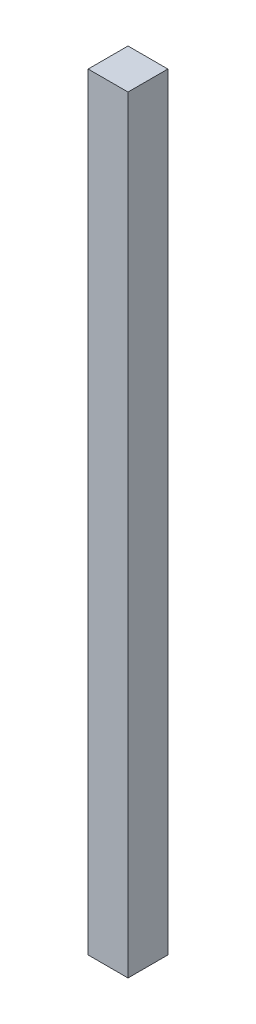
ISO-10303-21;
HEADER;
FILE_DESCRIPTION(('STEP AP214'),'2;1');
FILE_NAME('part.step','',(''),(''),'','','');
FILE_SCHEMA(('AUTOMOTIVE_DESIGN { 1 0 10303 214 1 1 1 1 }'));
ENDSEC;
DATA;
#1=APPLICATION_CONTEXT('core data for automotive mechanical design processes');
#2=APPLICATION_PROTOCOL_DEFINITION('international standard','automotive_design',2000,#1);
#3=PRODUCT_CONTEXT('',#1,'mechanical');
#4=PRODUCT('Part','Part','',(#3));
#5=PRODUCT_RELATED_PRODUCT_CATEGORY('part','',(#4));
#6=PRODUCT_DEFINITION_FORMATION('','',#4);
#7=PRODUCT_DEFINITION_CONTEXT('part definition',#1,'design');
#8=PRODUCT_DEFINITION('design','',#6,#7);
#9=PRODUCT_DEFINITION_SHAPE('','',#8);
#10=(LENGTH_UNIT() NAMED_UNIT(*) SI_UNIT(.MILLI.,.METRE.));
#11=(NAMED_UNIT(*) PLANE_ANGLE_UNIT() SI_UNIT($,.RADIAN.));
#12=(NAMED_UNIT(*) SI_UNIT($,.STERADIAN.) SOLID_ANGLE_UNIT());
#13=UNCERTAINTY_MEASURE_WITH_UNIT(LENGTH_MEASURE(1.E-05),#10,'distance_accuracy_value','');
#14=(GEOMETRIC_REPRESENTATION_CONTEXT(3) GLOBAL_UNCERTAINTY_ASSIGNED_CONTEXT((#13)) GLOBAL_UNIT_ASSIGNED_CONTEXT((#10,
#11,#12)) REPRESENTATION_CONTEXT('',''));
#15=CARTESIAN_POINT('',(0.,0.,0.));
#16=DIRECTION('',(0.,0.,1.));
#17=DIRECTION('',(1.,0.,0.));
#18=AXIS2_PLACEMENT_3D('',#15,#16,#17);
#19=CARTESIAN_POINT('',(0.3,11.55,0.3));
#20=DIRECTION('',(-1.,0.,0.));
#21=DIRECTION('',(0.,0.,1.));
#22=AXIS2_PLACEMENT_3D('',#19,#20,#21);
#23=PLANE('',#22);
#24=DIRECTION('',(0.,0.,-1.));
#25=VECTOR('',#24,1.);
#26=CARTESIAN_POINT('',(0.3,0.,0.3));
#27=LINE('',#26,#25);
#28=CARTESIAN_POINT('',(0.3,0.,0.3));
#29=VERTEX_POINT('',#28);
#30=CARTESIAN_POINT('',(0.3,0.,-0.3));
#31=VERTEX_POINT('',#30);
#32=EDGE_CURVE('E113',#29,#31,#27,.T.);
#33=ORIENTED_EDGE('',*,*,#32,.T.);
#34=DIRECTION('',(0.,-1.,0.));
#35=VECTOR('',#34,1.);
#36=CARTESIAN_POINT('',(0.3,11.55,-0.3));
#37=LINE('',#36,#35);
#38=CARTESIAN_POINT('',(0.3,11.55,-0.3));
#39=VERTEX_POINT('',#38);
#40=EDGE_CURVE('E11',#39,#31,#37,.T.);
#41=ORIENTED_EDGE('',*,*,#40,.F.);
#42=DIRECTION('',(0.,0.,-1.));
#43=VECTOR('',#42,1.);
#44=CARTESIAN_POINT('',(0.3,11.55,0.3));
#45=LINE('',#44,#43);
#46=CARTESIAN_POINT('',(0.3,11.55,0.3));
#47=VERTEX_POINT('',#46);
#48=EDGE_CURVE('E97',#47,#39,#45,.T.);
#49=ORIENTED_EDGE('',*,*,#48,.F.);
#50=DIRECTION('',(0.,-1.,0.));
#51=VECTOR('',#50,1.);
#52=CARTESIAN_POINT('',(0.3,11.55,0.3));
#53=LINE('',#52,#51);
#54=EDGE_CURVE('E109',#47,#29,#53,.T.);
#55=ORIENTED_EDGE('',*,*,#54,.T.);
#56=EDGE_LOOP('',(#33,#41,#49,#55));
#57=FACE_BOUND('',#56,.T.);
#58=ADVANCED_FACE('F45',(#57),#23,.F.);
#59=CARTESIAN_POINT('',(-0.3,11.55,-0.3));
#60=DIRECTION('',(0.,0.,1.));
#61=DIRECTION('',(1.,0.,0.));
#62=AXIS2_PLACEMENT_3D('',#59,#60,#61);
#63=PLANE('',#62);
#64=DIRECTION('',(-1.,0.,0.));
#65=VECTOR('',#64,1.);
#66=CARTESIAN_POINT('',(-0.3,0.,-0.3));
#67=LINE('',#66,#65);
#68=CARTESIAN_POINT('',(-0.3,0.,-0.3));
#69=VERTEX_POINT('',#68);
#70=EDGE_CURVE('E102',#31,#69,#67,.T.);
#71=ORIENTED_EDGE('',*,*,#70,.T.);
#72=DIRECTION('',(0.,-1.,0.));
#73=VECTOR('',#72,1.);
#74=CARTESIAN_POINT('',(-0.3,11.55,-0.3));
#75=LINE('',#74,#73);
#76=CARTESIAN_POINT('',(-0.3,11.55,-0.3));
#77=VERTEX_POINT('',#76);
#78=EDGE_CURVE('E54',#77,#69,#75,.T.);
#79=ORIENTED_EDGE('',*,*,#78,.F.);
#80=DIRECTION('',(-1.,0.,0.));
#81=VECTOR('',#80,1.);
#82=CARTESIAN_POINT('',(-0.3,11.55,-0.3));
#83=LINE('',#82,#81);
#84=EDGE_CURVE('E92',#39,#77,#83,.T.);
#85=ORIENTED_EDGE('',*,*,#84,.F.);
#86=ORIENTED_EDGE('',*,*,#40,.T.);
#87=EDGE_LOOP('',(#71,#79,#85,#86));
#88=FACE_BOUND('',#87,.T.);
#89=ADVANCED_FACE('F101',(#88),#63,.F.);
#90=CARTESIAN_POINT('',(-0.3,11.55,0.3));
#91=DIRECTION('',(1.,0.,0.));
#92=DIRECTION('',(0.,0.,-1.));
#93=AXIS2_PLACEMENT_3D('',#90,#91,#92);
#94=PLANE('',#93);
#95=DIRECTION('',(0.,0.,1.));
#96=VECTOR('',#95,1.);
#97=CARTESIAN_POINT('',(-0.3,0.,0.3));
#98=LINE('',#97,#96);
#99=CARTESIAN_POINT('',(-0.3,0.,0.3));
#100=VERTEX_POINT('',#99);
#101=EDGE_CURVE('E79',#69,#100,#98,.T.);
#102=ORIENTED_EDGE('',*,*,#101,.T.);
#103=DIRECTION('',(0.,-1.,0.));
#104=VECTOR('',#103,1.);
#105=CARTESIAN_POINT('',(-0.3,11.55,0.3));
#106=LINE('',#105,#104);
#107=CARTESIAN_POINT('',(-0.3,11.55,0.3));
#108=VERTEX_POINT('',#107);
#109=EDGE_CURVE('E104',#108,#100,#106,.T.);
#110=ORIENTED_EDGE('',*,*,#109,.F.);
#111=DIRECTION('',(0.,0.,1.));
#112=VECTOR('',#111,1.);
#113=CARTESIAN_POINT('',(-0.3,11.55,0.3));
#114=LINE('',#113,#112);
#115=EDGE_CURVE('E95',#77,#108,#114,.T.);
#116=ORIENTED_EDGE('',*,*,#115,.F.);
#117=ORIENTED_EDGE('',*,*,#78,.T.);
#118=EDGE_LOOP('',(#102,#110,#116,#117));
#119=FACE_BOUND('',#118,.T.);
#120=ADVANCED_FACE('F105',(#119),#94,.F.);
#121=CARTESIAN_POINT('',(-0.3,11.55,0.3));
#122=DIRECTION('',(0.,0.,-1.));
#123=DIRECTION('',(-1.,0.,0.));
#124=AXIS2_PLACEMENT_3D('',#121,#122,#123);
#125=PLANE('',#124);
#126=DIRECTION('',(1.,0.,0.));
#127=VECTOR('',#126,1.);
#128=CARTESIAN_POINT('',(-0.3,0.,0.3));
#129=LINE('',#128,#127);
#130=EDGE_CURVE('E85',#100,#29,#129,.T.);
#131=ORIENTED_EDGE('',*,*,#130,.T.);
#132=ORIENTED_EDGE('',*,*,#54,.F.);
#133=DIRECTION('',(1.,0.,0.));
#134=VECTOR('',#133,1.);
#135=CARTESIAN_POINT('',(-0.3,11.55,0.3));
#136=LINE('',#135,#134);
#137=EDGE_CURVE('E62',#108,#47,#136,.T.);
#138=ORIENTED_EDGE('',*,*,#137,.F.);
#139=ORIENTED_EDGE('',*,*,#109,.T.);
#140=EDGE_LOOP('',(#131,#132,#138,#139));
#141=FACE_BOUND('',#140,.T.);
#142=ADVANCED_FACE('F126',(#141),#125,.F.);
#143=CARTESIAN_POINT('',(0.,11.55,0.));
#144=DIRECTION('',(0.,-1.,0.));
#145=DIRECTION('',(0.,0.,-1.));
#146=AXIS2_PLACEMENT_3D('',#143,#144,#145);
#147=PLANE('',#146);
#148=ORIENTED_EDGE('',*,*,#48,.T.);
#149=ORIENTED_EDGE('',*,*,#84,.T.);
#150=ORIENTED_EDGE('',*,*,#115,.T.);
#151=ORIENTED_EDGE('',*,*,#137,.T.);
#152=EDGE_LOOP('',(#148,#149,#150,#151));
#153=FACE_BOUND('',#152,.T.);
#154=ADVANCED_FACE('F93',(#153),#147,.F.);
#155=CARTESIAN_POINT('',(0.,0.,0.));
#156=DIRECTION('',(0.,-1.,0.));
#157=DIRECTION('',(0.,0.,-1.));
#158=AXIS2_PLACEMENT_3D('',#155,#156,#157);
#159=PLANE('',#158);
#160=ORIENTED_EDGE('',*,*,#32,.F.);
#161=ORIENTED_EDGE('',*,*,#130,.F.);
#162=ORIENTED_EDGE('',*,*,#101,.F.);
#163=ORIENTED_EDGE('',*,*,#70,.F.);
#164=EDGE_LOOP('',(#160,#161,#162,#163));
#165=FACE_BOUND('',#164,.T.);
#166=ADVANCED_FACE('F129',(#165),#159,.T.);
#167=CLOSED_SHELL('',(#58,#89,#120,#142,#154,#166));
#168=MANIFOLD_SOLID_BREP('B2',#167);
#169=ADVANCED_BREP_SHAPE_REPRESENTATION('',(#18,#168),#14);
#170=SHAPE_DEFINITION_REPRESENTATION(#9,#169);
ENDSEC;
END-ISO-10303-21;
